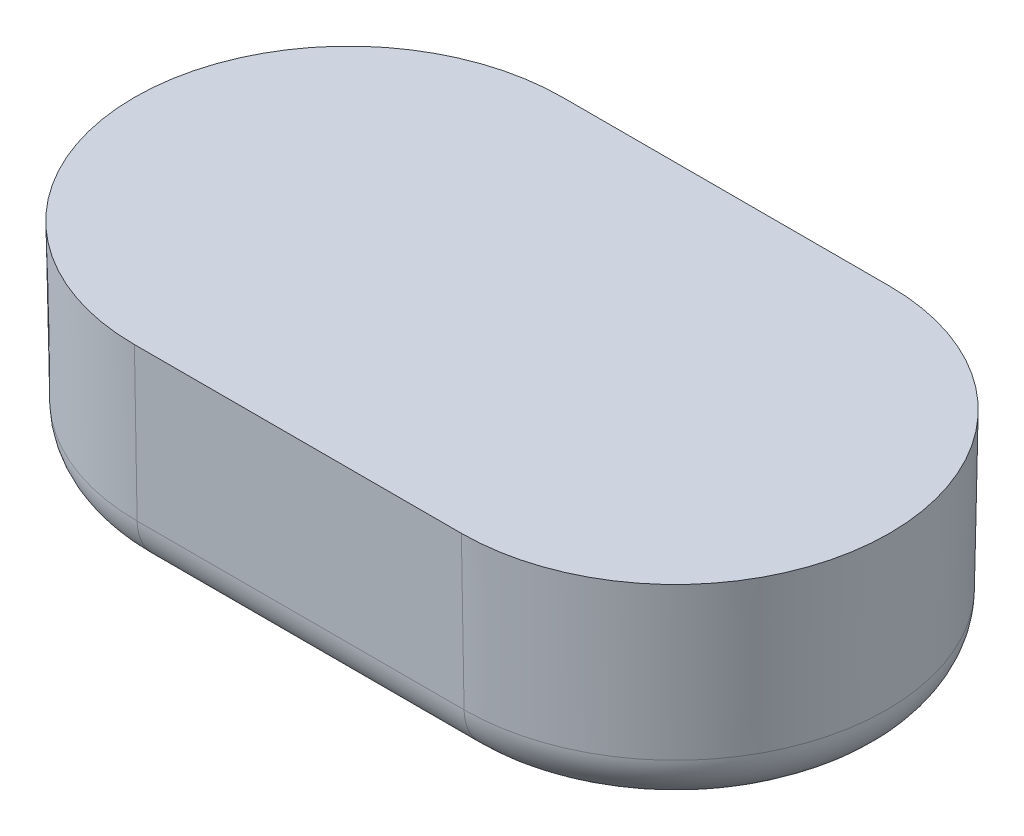
ISO-10303-21;
HEADER;
FILE_DESCRIPTION(('STEP AP214'),'2;1');
FILE_NAME('part.step','',(''),(''),'','','');
FILE_SCHEMA(('AUTOMOTIVE_DESIGN { 1 0 10303 214 1 1 1 1 }'));
ENDSEC;
DATA;
#1=APPLICATION_CONTEXT('core data for automotive mechanical design processes');
#2=APPLICATION_PROTOCOL_DEFINITION('international standard','automotive_design',2000,#1);
#3=PRODUCT_CONTEXT('',#1,'mechanical');
#4=PRODUCT('Part','Part','',(#3));
#5=PRODUCT_RELATED_PRODUCT_CATEGORY('part','',(#4));
#6=PRODUCT_DEFINITION_FORMATION('','',#4);
#7=PRODUCT_DEFINITION_CONTEXT('part definition',#1,'design');
#8=PRODUCT_DEFINITION('design','',#6,#7);
#9=PRODUCT_DEFINITION_SHAPE('','',#8);
#10=(LENGTH_UNIT() NAMED_UNIT(*) SI_UNIT(.MILLI.,.METRE.));
#11=(NAMED_UNIT(*) PLANE_ANGLE_UNIT() SI_UNIT($,.RADIAN.));
#12=(NAMED_UNIT(*) SI_UNIT($,.STERADIAN.) SOLID_ANGLE_UNIT());
#13=UNCERTAINTY_MEASURE_WITH_UNIT(LENGTH_MEASURE(1.E-05),#10,'distance_accuracy_value','');
#14=(GEOMETRIC_REPRESENTATION_CONTEXT(3) GLOBAL_UNCERTAINTY_ASSIGNED_CONTEXT((#13)) GLOBAL_UNIT_ASSIGNED_CONTEXT((#10,
#11,#12)) REPRESENTATION_CONTEXT('',''));
#15=CARTESIAN_POINT('',(0.,0.,0.));
#16=DIRECTION('',(0.,0.,1.));
#17=DIRECTION('',(1.,0.,0.));
#18=AXIS2_PLACEMENT_3D('',#15,#16,#17);
#19=CARTESIAN_POINT('',(-107.,0.,105.));
#20=DIRECTION('',(0.,1.,0.));
#21=DIRECTION('',(0.,0.,1.));
#22=AXIS2_PLACEMENT_3D('',#19,#20,#21);
#23=PLANE('',#22);
#24=DIRECTION('',(-1.,0.,0.));
#25=VECTOR('',#24,1.);
#26=CARTESIAN_POINT('',(-107.,0.,114.412267691227));
#27=LINE('',#26,#25);
#28=CARTESIAN_POINT('',(-87.805,0.,114.412267691227));
#29=VERTEX_POINT('',#28);
#30=CARTESIAN_POINT('',(-107.,0.,114.412267691227));
#31=VERTEX_POINT('',#30);
#32=EDGE_CURVE('E752',#29,#31,#27,.T.);
#33=ORIENTED_EDGE('',*,*,#32,.T.);
#34=CARTESIAN_POINT('',(-107.,0.,105.));
#35=DIRECTION('',(0.,1.,0.));
#36=DIRECTION('',(0.,0.,1.));
#37=AXIS2_PLACEMENT_3D('',#34,#35,#36);
#38=CIRCLE('',#37,9.41226769122721);
#39=CARTESIAN_POINT('',(-107.,0.,95.5877323087728));
#40=VERTEX_POINT('',#39);
#41=EDGE_CURVE('E758',#31,#40,#38,.F.);
#42=ORIENTED_EDGE('',*,*,#41,.T.);
#43=DIRECTION('',(1.,0.,0.));
#44=VECTOR('',#43,1.);
#45=CARTESIAN_POINT('',(-107.,0.,95.5877323087728));
#46=LINE('',#45,#44);
#47=CARTESIAN_POINT('',(-87.8050000000001,0.,95.5877323087728));
#48=VERTEX_POINT('',#47);
#49=EDGE_CURVE('E756',#40,#48,#46,.T.);
#50=ORIENTED_EDGE('',*,*,#49,.T.);
#51=CARTESIAN_POINT('',(-87.805,0.,105.));
#52=DIRECTION('',(0.,1.,0.));
#53=DIRECTION('',(0.,0.,1.));
#54=AXIS2_PLACEMENT_3D('',#51,#52,#53);
#55=CIRCLE('',#54,9.41226769122721);
#56=EDGE_CURVE('E754',#48,#29,#55,.F.);
#57=ORIENTED_EDGE('',*,*,#56,.T.);
#58=EDGE_LOOP('',(#33,#42,#50,#57));
#59=FACE_BOUND('',#58,.T.);
#60=ADVANCED_FACE('F666',(#59),#23,.F.);
#61=CARTESIAN_POINT('',(-107.,8.,92.5));
#62=DIRECTION('',(0.,-0.0174524064372835,-0.999847695156391));
#63=DIRECTION('',(0.,0.999847695156391,-0.0174524064372835));
#64=AXIS2_PLACEMENT_3D('',#61,#62,#63);
#65=PLANE('',#64);
#66=DIRECTION('',(0.,0.999847695156391,-0.0174524064372835));
#67=VECTOR('',#66,1.);
#68=CARTESIAN_POINT('',(-87.8050000000001,8.,92.5));
#69=LINE('',#68,#67);
#70=CARTESIAN_POINT('',(-87.8050000000001,12.,92.4301797402871));
#71=VERTEX_POINT('',#70);
#72=CARTESIAN_POINT('',(-87.8050000000001,2.94764278068815,92.5881892233036));
#73=VERTEX_POINT('',#72);
#74=EDGE_CURVE('E748',#71,#73,#69,.F.);
#75=ORIENTED_EDGE('',*,*,#74,.T.);
#76=DIRECTION('',(-1.,0.,0.));
#77=VECTOR('',#76,1.);
#78=CARTESIAN_POINT('',(-107.,2.94764278068815,92.5881892233036));
#79=LINE('',#78,#77);
#80=CARTESIAN_POINT('',(-107.,2.94764278068815,92.5881892233036));
#81=VERTEX_POINT('',#80);
#82=EDGE_CURVE('E761',#73,#81,#79,.T.);
#83=ORIENTED_EDGE('',*,*,#82,.T.);
#84=DIRECTION('',(0.,0.999847695156391,-0.0174524064372835));
#85=VECTOR('',#84,1.);
#86=CARTESIAN_POINT('',(-107.,8.,92.5));
#87=LINE('',#86,#85);
#88=CARTESIAN_POINT('',(-107.,12.,92.4301797402871));
#89=VERTEX_POINT('',#88);
#90=EDGE_CURVE('E746',#89,#81,#87,.F.);
#91=ORIENTED_EDGE('',*,*,#90,.F.);
#92=DIRECTION('',(1.,0.,0.));
#93=VECTOR('',#92,1.);
#94=CARTESIAN_POINT('',(-87.8050000000001,12.,92.4301797402871));
#95=LINE('',#94,#93);
#96=EDGE_CURVE('E740',#71,#89,#95,.F.);
#97=ORIENTED_EDGE('',*,*,#96,.F.);
#98=EDGE_LOOP('',(#75,#83,#91,#97));
#99=FACE_BOUND('',#98,.T.);
#100=ADVANCED_FACE('F805',(#99),#65,.T.);
#101=CARTESIAN_POINT('',(-87.805,8.,105.));
#102=DIRECTION('',(0.,1.,0.));
#103=DIRECTION('',(0.,0.,-1.));
#104=AXIS2_PLACEMENT_3D('',#101,#102,#103);
#105=CONICAL_SURFACE('',#104,12.5,0.0174532925199433);
#106=DIRECTION('',(0.,0.999847695156391,0.0174524064372835));
#107=VECTOR('',#106,1.);
#108=CARTESIAN_POINT('',(-87.805,8.,117.5));
#109=LINE('',#108,#107);
#110=CARTESIAN_POINT('',(-87.805,12.,117.569820259713));
#111=VERTEX_POINT('',#110);
#112=CARTESIAN_POINT('',(-87.805,2.94764278068815,117.411810776696));
#113=VERTEX_POINT('',#112);
#114=EDGE_CURVE('E727',#111,#113,#109,.F.);
#115=ORIENTED_EDGE('',*,*,#114,.T.);
#116=CARTESIAN_POINT('',(-87.805,2.94764278068815,105.));
#117=DIRECTION('',(0.,-1.,0.));
#118=DIRECTION('',(0.,0.,-1.));
#119=AXIS2_PLACEMENT_3D('',#116,#117,#118);
#120=CIRCLE('',#119,12.4118107766964);
#121=EDGE_CURVE('E675',#113,#73,#120,.F.);
#122=ORIENTED_EDGE('',*,*,#121,.T.);
#123=ORIENTED_EDGE('',*,*,#74,.F.);
#124=CARTESIAN_POINT('',(-87.805,12.,105.));
#125=DIRECTION('',(0.,1.,0.));
#126=DIRECTION('',(0.,0.,1.));
#127=AXIS2_PLACEMENT_3D('',#124,#125,#126);
#128=CIRCLE('',#127,12.5698202597129);
#129=EDGE_CURVE('E735',#111,#71,#128,.T.);
#130=ORIENTED_EDGE('',*,*,#129,.F.);
#131=EDGE_LOOP('',(#115,#122,#123,#130));
#132=FACE_BOUND('',#131,.T.);
#133=ADVANCED_FACE('F800',(#132),#105,.T.);
#134=CARTESIAN_POINT('',(-107.,8.,117.5));
#135=DIRECTION('',(0.,-0.0174524064372835,0.999847695156391));
#136=DIRECTION('',(0.,-0.999847695156391,-0.0174524064372835));
#137=AXIS2_PLACEMENT_3D('',#134,#135,#136);
#138=PLANE('',#137);
#139=DIRECTION('',(0.,0.999847695156391,0.0174524064372835));
#140=VECTOR('',#139,1.);
#141=CARTESIAN_POINT('',(-107.,8.,117.5));
#142=LINE('',#141,#140);
#143=CARTESIAN_POINT('',(-107.,12.,117.569820259713));
#144=VERTEX_POINT('',#143);
#145=CARTESIAN_POINT('',(-107.,2.94764278068815,117.411810776696));
#146=VERTEX_POINT('',#145);
#147=EDGE_CURVE('E719',#144,#146,#142,.F.);
#148=ORIENTED_EDGE('',*,*,#147,.T.);
#149=DIRECTION('',(1.,0.,0.));
#150=VECTOR('',#149,1.);
#151=CARTESIAN_POINT('',(-107.,2.94764278068815,117.411810776696));
#152=LINE('',#151,#150);
#153=EDGE_CURVE('E502',#146,#113,#152,.T.);
#154=ORIENTED_EDGE('',*,*,#153,.T.);
#155=ORIENTED_EDGE('',*,*,#114,.F.);
#156=DIRECTION('',(-1.,0.,0.));
#157=VECTOR('',#156,1.);
#158=CARTESIAN_POINT('',(-107.,12.,117.569820259713));
#159=LINE('',#158,#157);
#160=EDGE_CURVE('E730',#144,#111,#159,.F.);
#161=ORIENTED_EDGE('',*,*,#160,.F.);
#162=EDGE_LOOP('',(#148,#154,#155,#161));
#163=FACE_BOUND('',#162,.T.);
#164=ADVANCED_FACE('F731',(#163),#138,.T.);
#165=CARTESIAN_POINT('',(-107.,8.,105.));
#166=DIRECTION('',(0.,1.,0.));
#167=DIRECTION('',(0.,0.,-1.));
#168=AXIS2_PLACEMENT_3D('',#165,#166,#167);
#169=CONICAL_SURFACE('',#168,12.5,0.0174532925199433);
#170=ORIENTED_EDGE('',*,*,#90,.T.);
#171=CARTESIAN_POINT('',(-107.,2.94764278068815,105.));
#172=DIRECTION('',(0.,-1.,0.));
#173=DIRECTION('',(0.,0.,-1.));
#174=AXIS2_PLACEMENT_3D('',#171,#172,#173);
#175=CIRCLE('',#174,12.4118107766964);
#176=EDGE_CURVE('E726',#81,#146,#175,.F.);
#177=ORIENTED_EDGE('',*,*,#176,.T.);
#178=ORIENTED_EDGE('',*,*,#147,.F.);
#179=CARTESIAN_POINT('',(-107.,12.,105.));
#180=DIRECTION('',(0.,1.,0.));
#181=DIRECTION('',(0.,0.,1.));
#182=AXIS2_PLACEMENT_3D('',#179,#180,#181);
#183=CIRCLE('',#182,12.5698202597129);
#184=EDGE_CURVE('E724',#89,#144,#183,.T.);
#185=ORIENTED_EDGE('',*,*,#184,.F.);
#186=EDGE_LOOP('',(#170,#177,#178,#185));
#187=FACE_BOUND('',#186,.T.);
#188=ADVANCED_FACE('F722',(#187),#169,.T.);
#189=CARTESIAN_POINT('',(-87.805,3.,105.));
#190=DIRECTION('',(0.,1.,0.));
#191=DIRECTION('',(0.,0.,1.));
#192=AXIS2_PLACEMENT_3D('',#189,#190,#191);
#193=TOROIDAL_SURFACE('',#192,9.41226769122721,3.);
#194=CARTESIAN_POINT('',(-87.805,3.,114.412267691227));
#195=DIRECTION('',(-1.,0.,0.));
#196=DIRECTION('',(0.,0.,1.));
#197=AXIS2_PLACEMENT_3D('',#194,#195,#196);
#198=CIRCLE('',#197,3.);
#199=EDGE_CURVE('E766',#29,#113,#198,.T.);
#200=ORIENTED_EDGE('',*,*,#199,.F.);
#201=ORIENTED_EDGE('',*,*,#56,.F.);
#202=CARTESIAN_POINT('',(-87.8050000000001,3.,95.5877323087728));
#203=DIRECTION('',(-1.,0.,0.));
#204=DIRECTION('',(0.,0.,1.));
#205=AXIS2_PLACEMENT_3D('',#202,#203,#204);
#206=CIRCLE('',#205,3.);
#207=EDGE_CURVE('E670',#73,#48,#206,.T.);
#208=ORIENTED_EDGE('',*,*,#207,.F.);
#209=ORIENTED_EDGE('',*,*,#121,.F.);
#210=EDGE_LOOP('',(#200,#201,#208,#209));
#211=FACE_BOUND('',#210,.T.);
#212=ADVANCED_FACE('F668',(#211),#193,.T.);
#213=CARTESIAN_POINT('',(-107.,3.,95.5877323087728));
#214=DIRECTION('',(1.,0.,0.));
#215=DIRECTION('',(0.,0.,-1.));
#216=AXIS2_PLACEMENT_3D('',#213,#214,#215);
#217=CYLINDRICAL_SURFACE('',#216,3.);
#218=ORIENTED_EDGE('',*,*,#207,.T.);
#219=ORIENTED_EDGE('',*,*,#49,.F.);
#220=CARTESIAN_POINT('',(-107.,3.,95.5877323087728));
#221=DIRECTION('',(-1.,0.,0.));
#222=DIRECTION('',(0.,0.,1.));
#223=AXIS2_PLACEMENT_3D('',#220,#221,#222);
#224=CIRCLE('',#223,3.);
#225=EDGE_CURVE('E765',#81,#40,#224,.T.);
#226=ORIENTED_EDGE('',*,*,#225,.F.);
#227=ORIENTED_EDGE('',*,*,#82,.F.);
#228=EDGE_LOOP('',(#218,#219,#226,#227));
#229=FACE_BOUND('',#228,.T.);
#230=ADVANCED_FACE('F776',(#229),#217,.T.);
#231=CARTESIAN_POINT('',(-107.,3.,114.412267691227));
#232=DIRECTION('',(-1.,0.,0.));
#233=DIRECTION('',(0.,0.,1.));
#234=AXIS2_PLACEMENT_3D('',#231,#232,#233);
#235=CYLINDRICAL_SURFACE('',#234,3.);
#236=ORIENTED_EDGE('',*,*,#199,.T.);
#237=ORIENTED_EDGE('',*,*,#153,.F.);
#238=CARTESIAN_POINT('',(-107.,3.,114.412267691227));
#239=DIRECTION('',(-1.,0.,0.));
#240=DIRECTION('',(0.,0.,1.));
#241=AXIS2_PLACEMENT_3D('',#238,#239,#240);
#242=CIRCLE('',#241,3.);
#243=EDGE_CURVE('E745',#31,#146,#242,.T.);
#244=ORIENTED_EDGE('',*,*,#243,.F.);
#245=ORIENTED_EDGE('',*,*,#32,.F.);
#246=EDGE_LOOP('',(#236,#237,#244,#245));
#247=FACE_BOUND('',#246,.T.);
#248=ADVANCED_FACE('F785',(#247),#235,.T.);
#249=CARTESIAN_POINT('',(-107.,3.,105.));
#250=DIRECTION('',(0.,1.,0.));
#251=DIRECTION('',(0.,0.,1.));
#252=AXIS2_PLACEMENT_3D('',#249,#250,#251);
#253=TOROIDAL_SURFACE('',#252,9.41226769122721,3.);
#254=ORIENTED_EDGE('',*,*,#225,.T.);
#255=ORIENTED_EDGE('',*,*,#41,.F.);
#256=ORIENTED_EDGE('',*,*,#243,.T.);
#257=ORIENTED_EDGE('',*,*,#176,.F.);
#258=EDGE_LOOP('',(#254,#255,#256,#257));
#259=FACE_BOUND('',#258,.T.);
#260=ADVANCED_FACE('F784',(#259),#253,.T.);
#261=CARTESIAN_POINT('',(-107.,12.,105.));
#262=DIRECTION('',(0.,1.,0.));
#263=DIRECTION('',(0.,0.,1.));
#264=AXIS2_PLACEMENT_3D('',#261,#262,#263);
#265=PLANE('',#264);
#266=ORIENTED_EDGE('',*,*,#184,.T.);
#267=ORIENTED_EDGE('',*,*,#160,.T.);
#268=ORIENTED_EDGE('',*,*,#129,.T.);
#269=ORIENTED_EDGE('',*,*,#96,.T.);
#270=EDGE_LOOP('',(#266,#267,#268,#269));
#271=FACE_BOUND('',#270,.T.);
#272=ADVANCED_FACE('F738',(#271),#265,.T.);
#273=CLOSED_SHELL('',(#60,#100,#133,#164,#188,#212,#230,#248,#260,#272));
#274=MANIFOLD_SOLID_BREP('B335',#273);
#275=ADVANCED_BREP_SHAPE_REPRESENTATION('',(#18,#274),#14);
#276=SHAPE_DEFINITION_REPRESENTATION(#9,#275);
ENDSEC;
END-ISO-10303-21;
